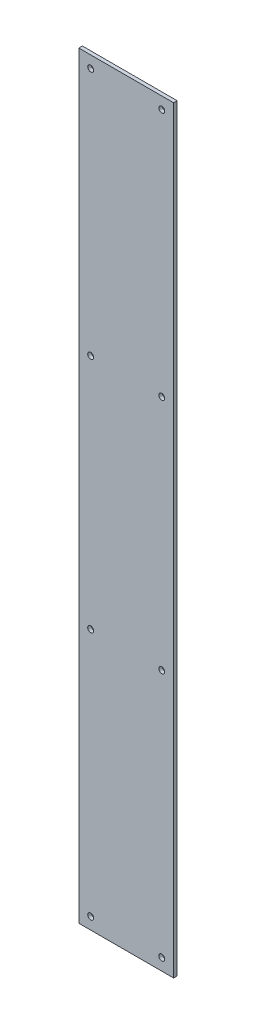
ISO-10303-21;
HEADER;
FILE_DESCRIPTION(('STEP AP214'),'2;1');
FILE_NAME('part.step','',(''),(''),'','','');
FILE_SCHEMA(('AUTOMOTIVE_DESIGN { 1 0 10303 214 1 1 1 1 }'));
ENDSEC;
DATA;
#1=APPLICATION_CONTEXT('core data for automotive mechanical design processes');
#2=APPLICATION_PROTOCOL_DEFINITION('international standard','automotive_design',2000,#1);
#3=PRODUCT_CONTEXT('',#1,'mechanical');
#4=PRODUCT('Part','Part','',(#3));
#5=PRODUCT_RELATED_PRODUCT_CATEGORY('part','',(#4));
#6=PRODUCT_DEFINITION_FORMATION('','',#4);
#7=PRODUCT_DEFINITION_CONTEXT('part definition',#1,'design');
#8=PRODUCT_DEFINITION('design','',#6,#7);
#9=PRODUCT_DEFINITION_SHAPE('','',#8);
#10=(LENGTH_UNIT() NAMED_UNIT(*) SI_UNIT(.MILLI.,.METRE.));
#11=(NAMED_UNIT(*) PLANE_ANGLE_UNIT() SI_UNIT($,.RADIAN.));
#12=(NAMED_UNIT(*) SI_UNIT($,.STERADIAN.) SOLID_ANGLE_UNIT());
#13=UNCERTAINTY_MEASURE_WITH_UNIT(LENGTH_MEASURE(1.E-05),#10,'distance_accuracy_value','');
#14=(GEOMETRIC_REPRESENTATION_CONTEXT(3) GLOBAL_UNCERTAINTY_ASSIGNED_CONTEXT((#13)) GLOBAL_UNIT_ASSIGNED_CONTEXT((#10,
#11,#12)) REPRESENTATION_CONTEXT('',''));
#15=CARTESIAN_POINT('',(0.,0.,0.));
#16=DIRECTION('',(0.,0.,1.));
#17=DIRECTION('',(1.,0.,0.));
#18=AXIS2_PLACEMENT_3D('',#15,#16,#17);
#19=CARTESIAN_POINT('',(-27.1074380165289,80.9917355371901,3.));
#20=DIRECTION('',(1.,0.,0.));
#21=DIRECTION('',(0.,1.,0.));
#22=AXIS2_PLACEMENT_3D('',#19,#20,#21);
#23=PLANE('',#22);
#24=DIRECTION('',(0.,-1.,0.));
#25=VECTOR('',#24,1.);
#26=CARTESIAN_POINT('',(-27.1074380165289,80.9917355371901,0.));
#27=LINE('',#26,#25);
#28=CARTESIAN_POINT('',(-27.1074380165289,80.9917355371901,0.));
#29=VERTEX_POINT('',#28);
#30=CARTESIAN_POINT('',(-27.1074380165288,-559.00826446281,0.));
#31=VERTEX_POINT('',#30);
#32=EDGE_CURVE('E96',#29,#31,#27,.T.);
#33=ORIENTED_EDGE('',*,*,#32,.T.);
#34=DIRECTION('',(0.,0.,-1.));
#35=VECTOR('',#34,1.);
#36=CARTESIAN_POINT('',(-27.1074380165288,-559.00826446281,3.));
#37=LINE('',#36,#35);
#38=CARTESIAN_POINT('',(-27.1074380165288,-559.00826446281,3.));
#39=VERTEX_POINT('',#38);
#40=EDGE_CURVE('E11',#39,#31,#37,.T.);
#41=ORIENTED_EDGE('',*,*,#40,.F.);
#42=DIRECTION('',(0.,-1.,0.));
#43=VECTOR('',#42,1.);
#44=CARTESIAN_POINT('',(-27.1074380165289,80.9917355371901,3.));
#45=LINE('',#44,#43);
#46=CARTESIAN_POINT('',(-27.1074380165289,80.9917355371901,3.));
#47=VERTEX_POINT('',#46);
#48=EDGE_CURVE('E84',#47,#39,#45,.T.);
#49=ORIENTED_EDGE('',*,*,#48,.F.);
#50=DIRECTION('',(0.,0.,-1.));
#51=VECTOR('',#50,1.);
#52=CARTESIAN_POINT('',(-27.1074380165289,80.9917355371901,3.));
#53=LINE('',#52,#51);
#54=EDGE_CURVE('E92',#47,#29,#53,.T.);
#55=ORIENTED_EDGE('',*,*,#54,.T.);
#56=EDGE_LOOP('',(#33,#41,#49,#55));
#57=FACE_BOUND('',#56,.T.);
#58=ADVANCED_FACE('F33',(#57),#23,.F.);
#59=CARTESIAN_POINT('',(-27.1074380165288,-559.00826446281,3.));
#60=DIRECTION('',(0.,1.,0.));
#61=DIRECTION('',(0.,0.,1.));
#62=AXIS2_PLACEMENT_3D('',#59,#60,#61);
#63=PLANE('',#62);
#64=DIRECTION('',(1.,0.,0.));
#65=VECTOR('',#64,1.);
#66=CARTESIAN_POINT('',(-27.1074380165288,-559.00826446281,0.));
#67=LINE('',#66,#65);
#68=CARTESIAN_POINT('',(52.8925619834712,-559.00826446281,0.));
#69=VERTEX_POINT('',#68);
#70=EDGE_CURVE('E88',#31,#69,#67,.T.);
#71=ORIENTED_EDGE('',*,*,#70,.T.);
#72=DIRECTION('',(0.,0.,-1.));
#73=VECTOR('',#72,1.);
#74=CARTESIAN_POINT('',(52.8925619834712,-559.00826446281,3.));
#75=LINE('',#74,#73);
#76=CARTESIAN_POINT('',(52.8925619834712,-559.00826446281,3.));
#77=VERTEX_POINT('',#76);
#78=EDGE_CURVE('E41',#77,#69,#75,.T.);
#79=ORIENTED_EDGE('',*,*,#78,.F.);
#80=DIRECTION('',(1.,0.,0.));
#81=VECTOR('',#80,1.);
#82=CARTESIAN_POINT('',(-27.1074380165288,-559.00826446281,3.));
#83=LINE('',#82,#81);
#84=EDGE_CURVE('E79',#39,#77,#83,.T.);
#85=ORIENTED_EDGE('',*,*,#84,.F.);
#86=ORIENTED_EDGE('',*,*,#40,.T.);
#87=EDGE_LOOP('',(#71,#79,#85,#86));
#88=FACE_BOUND('',#87,.T.);
#89=ADVANCED_FACE('F87',(#88),#63,.F.);
#90=CARTESIAN_POINT('',(52.8925619834711,80.9917355371901,3.));
#91=DIRECTION('',(-1.,0.,0.));
#92=DIRECTION('',(0.,-1.,0.));
#93=AXIS2_PLACEMENT_3D('',#90,#91,#92);
#94=PLANE('',#93);
#95=DIRECTION('',(0.,1.,0.));
#96=VECTOR('',#95,1.);
#97=CARTESIAN_POINT('',(52.8925619834711,80.9917355371901,0.));
#98=LINE('',#97,#96);
#99=CARTESIAN_POINT('',(52.8925619834711,80.9917355371901,0.));
#100=VERTEX_POINT('',#99);
#101=EDGE_CURVE('E66',#69,#100,#98,.T.);
#102=ORIENTED_EDGE('',*,*,#101,.T.);
#103=DIRECTION('',(0.,0.,-1.));
#104=VECTOR('',#103,1.);
#105=CARTESIAN_POINT('',(52.8925619834711,80.9917355371901,3.));
#106=LINE('',#105,#104);
#107=CARTESIAN_POINT('',(52.8925619834711,80.9917355371901,3.));
#108=VERTEX_POINT('',#107);
#109=EDGE_CURVE('E89',#108,#100,#106,.T.);
#110=ORIENTED_EDGE('',*,*,#109,.F.);
#111=DIRECTION('',(0.,1.,0.));
#112=VECTOR('',#111,1.);
#113=CARTESIAN_POINT('',(52.8925619834711,80.9917355371901,3.));
#114=LINE('',#113,#112);
#115=EDGE_CURVE('E82',#77,#108,#114,.T.);
#116=ORIENTED_EDGE('',*,*,#115,.F.);
#117=ORIENTED_EDGE('',*,*,#78,.T.);
#118=EDGE_LOOP('',(#102,#110,#116,#117));
#119=FACE_BOUND('',#118,.T.);
#120=ADVANCED_FACE('F90',(#119),#94,.F.);
#121=CARTESIAN_POINT('',(-27.1074380165289,80.9917355371901,3.));
#122=DIRECTION('',(0.,-1.,0.));
#123=DIRECTION('',(0.,0.,-1.));
#124=AXIS2_PLACEMENT_3D('',#121,#122,#123);
#125=PLANE('',#124);
#126=DIRECTION('',(-1.,0.,0.));
#127=VECTOR('',#126,1.);
#128=CARTESIAN_POINT('',(-27.1074380165289,80.9917355371901,0.));
#129=LINE('',#128,#127);
#130=EDGE_CURVE('E72',#100,#29,#129,.T.);
#131=ORIENTED_EDGE('',*,*,#130,.T.);
#132=ORIENTED_EDGE('',*,*,#54,.F.);
#133=DIRECTION('',(-1.,0.,0.));
#134=VECTOR('',#133,1.);
#135=CARTESIAN_POINT('',(-27.1074380165289,80.9917355371901,3.));
#136=LINE('',#135,#134);
#137=EDGE_CURVE('E49',#108,#47,#136,.T.);
#138=ORIENTED_EDGE('',*,*,#137,.F.);
#139=ORIENTED_EDGE('',*,*,#109,.T.);
#140=EDGE_LOOP('',(#131,#132,#138,#139));
#141=FACE_BOUND('',#140,.T.);
#142=ADVANCED_FACE('F104',(#141),#125,.F.);
#143=CARTESIAN_POINT('',(0.,0.,3.));
#144=DIRECTION('',(0.,0.,1.));
#145=DIRECTION('',(1.,0.,0.));
#146=AXIS2_PLACEMENT_3D('',#143,#144,#145);
#147=PLANE('',#146);
#148=CARTESIAN_POINT('',(-17.1074380165289,70.9917355371901,3.));
#149=DIRECTION('',(0.,0.,1.));
#150=DIRECTION('',(1.,0.,0.));
#151=AXIS2_PLACEMENT_3D('',#148,#149,#150);
#152=CIRCLE('',#151,2.5);
#153=CARTESIAN_POINT('',(-14.6074380165289,70.9917355371901,3.));
#154=VERTEX_POINT('',#153);
#155=EDGE_CURVE('E128',#154,#154,#152,.T.);
#156=ORIENTED_EDGE('',*,*,#155,.F.);
#157=EDGE_LOOP('',(#156));
#158=FACE_BOUND('',#157,.T.);
#159=CARTESIAN_POINT('',(-17.1074380165289,-339.00826446281,3.));
#160=DIRECTION('',(0.,0.,1.));
#161=DIRECTION('',(1.,0.,0.));
#162=AXIS2_PLACEMENT_3D('',#159,#160,#161);
#163=CIRCLE('',#162,2.5);
#164=CARTESIAN_POINT('',(-14.6074380165289,-339.00826446281,3.));
#165=VERTEX_POINT('',#164);
#166=EDGE_CURVE('E135',#165,#165,#163,.T.);
#167=ORIENTED_EDGE('',*,*,#166,.F.);
#168=EDGE_LOOP('',(#167));
#169=FACE_BOUND('',#168,.T.);
#170=CARTESIAN_POINT('',(42.8925619834712,70.9917355371902,3.));
#171=DIRECTION('',(0.,0.,1.));
#172=DIRECTION('',(1.,0.,0.));
#173=AXIS2_PLACEMENT_3D('',#170,#171,#172);
#174=CIRCLE('',#173,2.5);
#175=CARTESIAN_POINT('',(45.3925619834712,70.9917355371902,3.));
#176=VERTEX_POINT('',#175);
#177=EDGE_CURVE('E116',#176,#176,#174,.T.);
#178=ORIENTED_EDGE('',*,*,#177,.F.);
#179=EDGE_LOOP('',(#178));
#180=FACE_BOUND('',#179,.T.);
#181=CARTESIAN_POINT('',(-17.1074380165289,-549.00826446281,3.));
#182=DIRECTION('',(0.,0.,1.));
#183=DIRECTION('',(1.,0.,0.));
#184=AXIS2_PLACEMENT_3D('',#181,#182,#183);
#185=CIRCLE('',#184,2.5);
#186=CARTESIAN_POINT('',(-14.6074380165289,-549.00826446281,3.));
#187=VERTEX_POINT('',#186);
#188=EDGE_CURVE('E123',#187,#187,#185,.T.);
#189=ORIENTED_EDGE('',*,*,#188,.F.);
#190=EDGE_LOOP('',(#189));
#191=FACE_BOUND('',#190,.T.);
#192=CARTESIAN_POINT('',(-17.1074380165289,-139.00826446281,3.));
#193=DIRECTION('',(0.,0.,1.));
#194=DIRECTION('',(1.,0.,0.));
#195=AXIS2_PLACEMENT_3D('',#192,#193,#194);
#196=CIRCLE('',#195,2.5);
#197=CARTESIAN_POINT('',(-14.6074380165289,-139.00826446281,3.));
#198=VERTEX_POINT('',#197);
#199=EDGE_CURVE('E152',#198,#198,#196,.T.);
#200=ORIENTED_EDGE('',*,*,#199,.F.);
#201=EDGE_LOOP('',(#200));
#202=FACE_BOUND('',#201,.T.);
#203=CARTESIAN_POINT('',(42.8925619834712,-139.00826446281,3.));
#204=DIRECTION('',(0.,0.,1.));
#205=DIRECTION('',(1.,0.,0.));
#206=AXIS2_PLACEMENT_3D('',#203,#204,#205);
#207=CIRCLE('',#206,2.5);
#208=CARTESIAN_POINT('',(45.3925619834712,-139.00826446281,3.));
#209=VERTEX_POINT('',#208);
#210=EDGE_CURVE('E146',#209,#209,#207,.T.);
#211=ORIENTED_EDGE('',*,*,#210,.F.);
#212=EDGE_LOOP('',(#211));
#213=FACE_BOUND('',#212,.T.);
#214=CARTESIAN_POINT('',(42.8925619834712,-339.00826446281,3.));
#215=DIRECTION('',(0.,0.,1.));
#216=DIRECTION('',(1.,0.,0.));
#217=AXIS2_PLACEMENT_3D('',#214,#215,#216);
#218=CIRCLE('',#217,2.5);
#219=CARTESIAN_POINT('',(45.3925619834712,-339.00826446281,3.));
#220=VERTEX_POINT('',#219);
#221=EDGE_CURVE('E140',#220,#220,#218,.T.);
#222=ORIENTED_EDGE('',*,*,#221,.F.);
#223=EDGE_LOOP('',(#222));
#224=FACE_BOUND('',#223,.T.);
#225=CARTESIAN_POINT('',(42.8925619834712,-549.00826446281,3.));
#226=DIRECTION('',(0.,0.,1.));
#227=DIRECTION('',(1.,0.,0.));
#228=AXIS2_PLACEMENT_3D('',#225,#226,#227);
#229=CIRCLE('',#228,2.5);
#230=CARTESIAN_POINT('',(45.3925619834712,-549.00826446281,3.));
#231=VERTEX_POINT('',#230);
#232=EDGE_CURVE('E110',#231,#231,#229,.T.);
#233=ORIENTED_EDGE('',*,*,#232,.F.);
#234=EDGE_LOOP('',(#233));
#235=FACE_BOUND('',#234,.T.);
#236=ORIENTED_EDGE('',*,*,#48,.T.);
#237=ORIENTED_EDGE('',*,*,#84,.T.);
#238=ORIENTED_EDGE('',*,*,#115,.T.);
#239=ORIENTED_EDGE('',*,*,#137,.T.);
#240=EDGE_LOOP('',(#236,#237,#238,#239));
#241=FACE_BOUND('',#240,.T.);
#242=ADVANCED_FACE('F80',(#158,#169,#180,#191,#202,#213,#224,#235,#241),#147,.T.);
#243=CARTESIAN_POINT('',(0.,0.,0.));
#244=DIRECTION('',(0.,0.,1.));
#245=DIRECTION('',(1.,0.,0.));
#246=AXIS2_PLACEMENT_3D('',#243,#244,#245);
#247=PLANE('',#246);
#248=CARTESIAN_POINT('',(-17.1074380165289,70.9917355371901,0.));
#249=DIRECTION('',(0.,0.,1.));
#250=DIRECTION('',(1.,0.,0.));
#251=AXIS2_PLACEMENT_3D('',#248,#249,#250);
#252=CIRCLE('',#251,2.5);
#253=CARTESIAN_POINT('',(-14.6074380165289,70.9917355371901,0.));
#254=VERTEX_POINT('',#253);
#255=EDGE_CURVE('E131',#254,#254,#252,.T.);
#256=ORIENTED_EDGE('',*,*,#255,.T.);
#257=EDGE_LOOP('',(#256));
#258=FACE_BOUND('',#257,.T.);
#259=CARTESIAN_POINT('',(-17.1074380165289,-339.00826446281,0.));
#260=DIRECTION('',(0.,0.,1.));
#261=DIRECTION('',(1.,0.,0.));
#262=AXIS2_PLACEMENT_3D('',#259,#260,#261);
#263=CIRCLE('',#262,2.5);
#264=CARTESIAN_POINT('',(-14.6074380165289,-339.00826446281,0.));
#265=VERTEX_POINT('',#264);
#266=EDGE_CURVE('E120',#265,#265,#263,.T.);
#267=ORIENTED_EDGE('',*,*,#266,.T.);
#268=EDGE_LOOP('',(#267));
#269=FACE_BOUND('',#268,.T.);
#270=CARTESIAN_POINT('',(42.8925619834712,70.9917355371902,0.));
#271=DIRECTION('',(0.,0.,1.));
#272=DIRECTION('',(1.,0.,0.));
#273=AXIS2_PLACEMENT_3D('',#270,#271,#272);
#274=CIRCLE('',#273,2.5);
#275=CARTESIAN_POINT('',(45.3925619834712,70.9917355371902,0.));
#276=VERTEX_POINT('',#275);
#277=EDGE_CURVE('E119',#276,#276,#274,.T.);
#278=ORIENTED_EDGE('',*,*,#277,.T.);
#279=EDGE_LOOP('',(#278));
#280=FACE_BOUND('',#279,.T.);
#281=CARTESIAN_POINT('',(-17.1074380165289,-549.00826446281,0.));
#282=DIRECTION('',(0.,0.,1.));
#283=DIRECTION('',(1.,0.,0.));
#284=AXIS2_PLACEMENT_3D('',#281,#282,#283);
#285=CIRCLE('',#284,2.5);
#286=CARTESIAN_POINT('',(-14.6074380165289,-549.00826446281,0.));
#287=VERTEX_POINT('',#286);
#288=EDGE_CURVE('E113',#287,#287,#285,.T.);
#289=ORIENTED_EDGE('',*,*,#288,.T.);
#290=EDGE_LOOP('',(#289));
#291=FACE_BOUND('',#290,.T.);
#292=CARTESIAN_POINT('',(-17.1074380165289,-139.00826446281,0.));
#293=DIRECTION('',(0.,0.,1.));
#294=DIRECTION('',(1.,0.,0.));
#295=AXIS2_PLACEMENT_3D('',#292,#293,#294);
#296=CIRCLE('',#295,2.5);
#297=CARTESIAN_POINT('',(-14.6074380165289,-139.00826446281,0.));
#298=VERTEX_POINT('',#297);
#299=EDGE_CURVE('E132',#298,#298,#296,.T.);
#300=ORIENTED_EDGE('',*,*,#299,.T.);
#301=EDGE_LOOP('',(#300));
#302=FACE_BOUND('',#301,.T.);
#303=CARTESIAN_POINT('',(42.8925619834712,-139.00826446281,0.));
#304=DIRECTION('',(0.,0.,1.));
#305=DIRECTION('',(1.,0.,0.));
#306=AXIS2_PLACEMENT_3D('',#303,#304,#305);
#307=CIRCLE('',#306,2.5);
#308=CARTESIAN_POINT('',(45.3925619834712,-139.00826446281,0.));
#309=VERTEX_POINT('',#308);
#310=EDGE_CURVE('E149',#309,#309,#307,.T.);
#311=ORIENTED_EDGE('',*,*,#310,.T.);
#312=EDGE_LOOP('',(#311));
#313=FACE_BOUND('',#312,.T.);
#314=CARTESIAN_POINT('',(42.8925619834712,-339.00826446281,0.));
#315=DIRECTION('',(0.,0.,1.));
#316=DIRECTION('',(1.,0.,0.));
#317=AXIS2_PLACEMENT_3D('',#314,#315,#316);
#318=CIRCLE('',#317,2.5);
#319=CARTESIAN_POINT('',(45.3925619834712,-339.00826446281,0.));
#320=VERTEX_POINT('',#319);
#321=EDGE_CURVE('E143',#320,#320,#318,.T.);
#322=ORIENTED_EDGE('',*,*,#321,.T.);
#323=EDGE_LOOP('',(#322));
#324=FACE_BOUND('',#323,.T.);
#325=CARTESIAN_POINT('',(42.8925619834712,-549.00826446281,0.));
#326=DIRECTION('',(0.,0.,1.));
#327=DIRECTION('',(1.,0.,0.));
#328=AXIS2_PLACEMENT_3D('',#325,#326,#327);
#329=CIRCLE('',#328,2.5);
#330=CARTESIAN_POINT('',(45.3925619834712,-549.00826446281,0.));
#331=VERTEX_POINT('',#330);
#332=EDGE_CURVE('E99',#331,#331,#329,.T.);
#333=ORIENTED_EDGE('',*,*,#332,.T.);
#334=EDGE_LOOP('',(#333));
#335=FACE_BOUND('',#334,.T.);
#336=ORIENTED_EDGE('',*,*,#32,.F.);
#337=ORIENTED_EDGE('',*,*,#130,.F.);
#338=ORIENTED_EDGE('',*,*,#101,.F.);
#339=ORIENTED_EDGE('',*,*,#70,.F.);
#340=EDGE_LOOP('',(#336,#337,#338,#339));
#341=FACE_BOUND('',#340,.T.);
#342=ADVANCED_FACE('F107',(#258,#269,#280,#291,#302,#313,#324,#335,#341),#247,.F.);
#343=CARTESIAN_POINT('',(42.8925619834712,-549.00826446281,0.));
#344=DIRECTION('',(0.,0.,1.));
#345=DIRECTION('',(1.,0.,0.));
#346=AXIS2_PLACEMENT_3D('',#343,#344,#345);
#347=CYLINDRICAL_SURFACE('',#346,2.5);
#348=ORIENTED_EDGE('',*,*,#332,.F.);
#349=EDGE_LOOP('',(#348));
#350=FACE_BOUND('',#349,.T.);
#351=ORIENTED_EDGE('',*,*,#232,.T.);
#352=EDGE_LOOP('',(#351));
#353=FACE_BOUND('',#352,.T.);
#354=ADVANCED_FACE('F178',(#350,#353),#347,.F.);
#355=CARTESIAN_POINT('',(42.8925619834712,-339.00826446281,0.));
#356=DIRECTION('',(0.,0.,1.));
#357=DIRECTION('',(1.,0.,0.));
#358=AXIS2_PLACEMENT_3D('',#355,#356,#357);
#359=CYLINDRICAL_SURFACE('',#358,2.5);
#360=ORIENTED_EDGE('',*,*,#321,.F.);
#361=EDGE_LOOP('',(#360));
#362=FACE_BOUND('',#361,.T.);
#363=ORIENTED_EDGE('',*,*,#221,.T.);
#364=EDGE_LOOP('',(#363));
#365=FACE_BOUND('',#364,.T.);
#366=ADVANCED_FACE('F180',(#362,#365),#359,.F.);
#367=CARTESIAN_POINT('',(42.8925619834712,-139.00826446281,0.));
#368=DIRECTION('',(0.,0.,1.));
#369=DIRECTION('',(1.,0.,0.));
#370=AXIS2_PLACEMENT_3D('',#367,#368,#369);
#371=CYLINDRICAL_SURFACE('',#370,2.5);
#372=ORIENTED_EDGE('',*,*,#310,.F.);
#373=EDGE_LOOP('',(#372));
#374=FACE_BOUND('',#373,.T.);
#375=ORIENTED_EDGE('',*,*,#210,.T.);
#376=EDGE_LOOP('',(#375));
#377=FACE_BOUND('',#376,.T.);
#378=ADVANCED_FACE('F164',(#374,#377),#371,.F.);
#379=CARTESIAN_POINT('',(-17.1074380165289,-139.00826446281,0.));
#380=DIRECTION('',(0.,0.,1.));
#381=DIRECTION('',(1.,0.,0.));
#382=AXIS2_PLACEMENT_3D('',#379,#380,#381);
#383=CYLINDRICAL_SURFACE('',#382,2.5);
#384=ORIENTED_EDGE('',*,*,#299,.F.);
#385=EDGE_LOOP('',(#384));
#386=FACE_BOUND('',#385,.T.);
#387=ORIENTED_EDGE('',*,*,#199,.T.);
#388=EDGE_LOOP('',(#387));
#389=FACE_BOUND('',#388,.T.);
#390=ADVANCED_FACE('F160',(#386,#389),#383,.F.);
#391=CARTESIAN_POINT('',(-17.1074380165289,-549.00826446281,0.));
#392=DIRECTION('',(0.,0.,1.));
#393=DIRECTION('',(1.,0.,0.));
#394=AXIS2_PLACEMENT_3D('',#391,#392,#393);
#395=CYLINDRICAL_SURFACE('',#394,2.5);
#396=ORIENTED_EDGE('',*,*,#288,.F.);
#397=EDGE_LOOP('',(#396));
#398=FACE_BOUND('',#397,.T.);
#399=ORIENTED_EDGE('',*,*,#188,.T.);
#400=EDGE_LOOP('',(#399));
#401=FACE_BOUND('',#400,.T.);
#402=ADVANCED_FACE('F163',(#398,#401),#395,.F.);
#403=CARTESIAN_POINT('',(42.8925619834712,70.9917355371902,0.));
#404=DIRECTION('',(0.,0.,1.));
#405=DIRECTION('',(1.,0.,0.));
#406=AXIS2_PLACEMENT_3D('',#403,#404,#405);
#407=CYLINDRICAL_SURFACE('',#406,2.5);
#408=ORIENTED_EDGE('',*,*,#277,.F.);
#409=EDGE_LOOP('',(#408));
#410=FACE_BOUND('',#409,.T.);
#411=ORIENTED_EDGE('',*,*,#177,.T.);
#412=EDGE_LOOP('',(#411));
#413=FACE_BOUND('',#412,.T.);
#414=ADVANCED_FACE('F249',(#410,#413),#407,.F.);
#415=CARTESIAN_POINT('',(-17.1074380165289,-339.00826446281,0.));
#416=DIRECTION('',(0.,0.,1.));
#417=DIRECTION('',(1.,0.,0.));
#418=AXIS2_PLACEMENT_3D('',#415,#416,#417);
#419=CYLINDRICAL_SURFACE('',#418,2.5);
#420=ORIENTED_EDGE('',*,*,#266,.F.);
#421=EDGE_LOOP('',(#420));
#422=FACE_BOUND('',#421,.T.);
#423=ORIENTED_EDGE('',*,*,#166,.T.);
#424=EDGE_LOOP('',(#423));
#425=FACE_BOUND('',#424,.T.);
#426=ADVANCED_FACE('F259',(#422,#425),#419,.F.);
#427=CARTESIAN_POINT('',(-17.1074380165289,70.9917355371901,0.));
#428=DIRECTION('',(0.,0.,1.));
#429=DIRECTION('',(1.,0.,0.));
#430=AXIS2_PLACEMENT_3D('',#427,#428,#429);
#431=CYLINDRICAL_SURFACE('',#430,2.5);
#432=ORIENTED_EDGE('',*,*,#255,.F.);
#433=EDGE_LOOP('',(#432));
#434=FACE_BOUND('',#433,.T.);
#435=ORIENTED_EDGE('',*,*,#155,.T.);
#436=EDGE_LOOP('',(#435));
#437=FACE_BOUND('',#436,.T.);
#438=ADVANCED_FACE('F268',(#434,#437),#431,.F.);
#439=CLOSED_SHELL('',(#58,#89,#120,#142,#242,#342,#354,#366,#378,#390,#402,#414,#426,#438));
#440=MANIFOLD_SOLID_BREP('B2',#439);
#441=ADVANCED_BREP_SHAPE_REPRESENTATION('',(#18,#440),#14);
#442=SHAPE_DEFINITION_REPRESENTATION(#9,#441);
ENDSEC;
END-ISO-10303-21;
